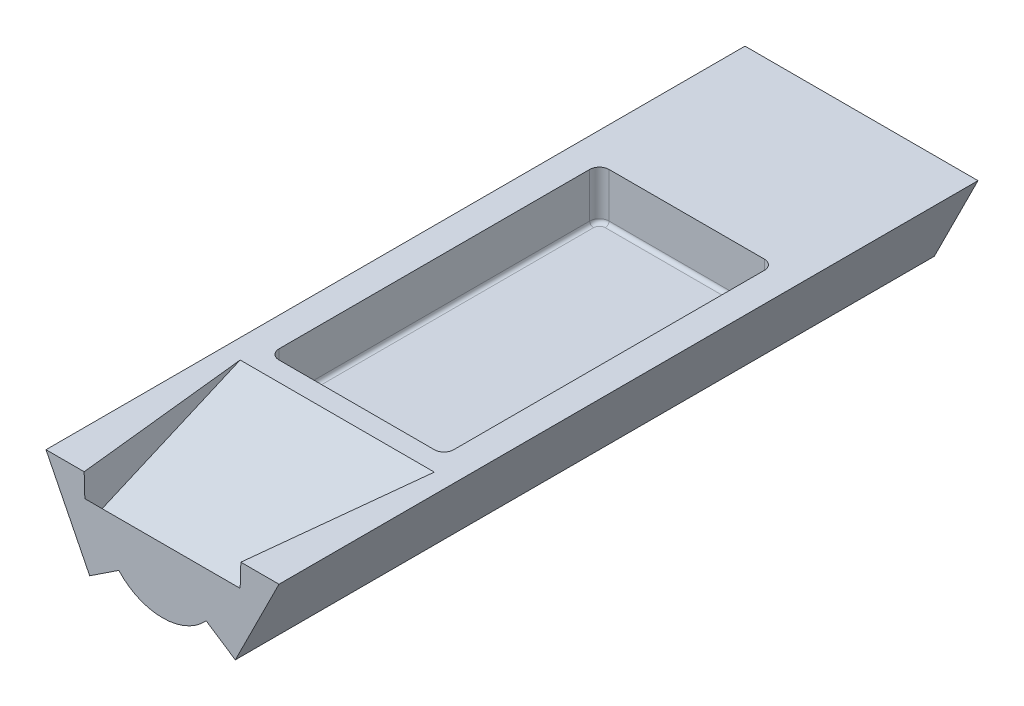
ISO-10303-21;
HEADER;
FILE_DESCRIPTION(('STEP AP214'),'2;1');
FILE_NAME('part.step','',(''),(''),'','','');
FILE_SCHEMA(('AUTOMOTIVE_DESIGN { 1 0 10303 214 1 1 1 1 }'));
ENDSEC;
DATA;
#1=APPLICATION_CONTEXT('core data for automotive mechanical design processes');
#2=APPLICATION_PROTOCOL_DEFINITION('international standard','automotive_design',2000,#1);
#3=PRODUCT_CONTEXT('',#1,'mechanical');
#4=PRODUCT('Part','Part','',(#3));
#5=PRODUCT_RELATED_PRODUCT_CATEGORY('part','',(#4));
#6=PRODUCT_DEFINITION_FORMATION('','',#4);
#7=PRODUCT_DEFINITION_CONTEXT('part definition',#1,'design');
#8=PRODUCT_DEFINITION('design','',#6,#7);
#9=PRODUCT_DEFINITION_SHAPE('','',#8);
#10=(LENGTH_UNIT() NAMED_UNIT(*) SI_UNIT(.MILLI.,.METRE.));
#11=(NAMED_UNIT(*) PLANE_ANGLE_UNIT() SI_UNIT($,.RADIAN.));
#12=(NAMED_UNIT(*) SI_UNIT($,.STERADIAN.) SOLID_ANGLE_UNIT());
#13=UNCERTAINTY_MEASURE_WITH_UNIT(LENGTH_MEASURE(1.E-05),#10,'distance_accuracy_value','');
#14=(GEOMETRIC_REPRESENTATION_CONTEXT(3) GLOBAL_UNCERTAINTY_ASSIGNED_CONTEXT((#13)) GLOBAL_UNIT_ASSIGNED_CONTEXT((#10,
#11,#12)) REPRESENTATION_CONTEXT('',''));
#15=CARTESIAN_POINT('',(0.,0.,0.));
#16=DIRECTION('',(0.,0.,1.));
#17=DIRECTION('',(1.,0.,0.));
#18=AXIS2_PLACEMENT_3D('',#15,#16,#17);
#19=CARTESIAN_POINT('',(0.,101.6,0.));
#20=DIRECTION('',(0.,-1.,0.));
#21=DIRECTION('',(0.,0.,-1.));
#22=AXIS2_PLACEMENT_3D('',#19,#20,#21);
#23=PLANE('',#22);
#24=CARTESIAN_POINT('',(203.2,101.6,-533.4));
#25=DIRECTION('',(0.,-1.,0.));
#26=DIRECTION('',(0.,0.,-1.));
#27=AXIS2_PLACEMENT_3D('',#24,#25,#26);
#28=CIRCLE('',#27,15.4);
#29=CARTESIAN_POINT('',(218.6,101.6,-533.4));
#30=VERTEX_POINT('',#29);
#31=CARTESIAN_POINT('',(203.2,101.6,-518.));
#32=VERTEX_POINT('',#31);
#33=EDGE_CURVE('E364',#30,#32,#28,.T.);
#34=ORIENTED_EDGE('',*,*,#33,.F.);
#35=DIRECTION('',(0.,0.,-1.));
#36=VECTOR('',#35,1.);
#37=CARTESIAN_POINT('',(218.6,101.6,-1371.6));
#38=LINE('',#37,#36);
#39=CARTESIAN_POINT('',(218.6,101.6,-1346.2));
#40=VERTEX_POINT('',#39);
#41=EDGE_CURVE('E323',#30,#40,#38,.T.);
#42=ORIENTED_EDGE('',*,*,#41,.T.);
#43=CARTESIAN_POINT('',(203.2,101.6,-1346.2));
#44=DIRECTION('',(0.,-1.,0.));
#45=DIRECTION('',(0.,0.,-1.));
#46=AXIS2_PLACEMENT_3D('',#43,#44,#45);
#47=CIRCLE('',#46,15.4);
#48=CARTESIAN_POINT('',(203.2,101.6,-1361.6));
#49=VERTEX_POINT('',#48);
#50=EDGE_CURVE('E353',#49,#40,#47,.T.);
#51=ORIENTED_EDGE('',*,*,#50,.F.);
#52=DIRECTION('',(-1.,0.,0.));
#53=VECTOR('',#52,1.);
#54=CARTESIAN_POINT('',(-228.6,101.6,-1361.6));
#55=LINE('',#54,#53);
#56=CARTESIAN_POINT('',(-203.2,101.6,-1361.6));
#57=VERTEX_POINT('',#56);
#58=EDGE_CURVE('E327',#49,#57,#55,.T.);
#59=ORIENTED_EDGE('',*,*,#58,.T.);
#60=CARTESIAN_POINT('',(-203.2,101.6,-1346.2));
#61=DIRECTION('',(0.,-1.,0.));
#62=DIRECTION('',(0.,0.,-1.));
#63=AXIS2_PLACEMENT_3D('',#60,#61,#62);
#64=CIRCLE('',#63,15.4);
#65=CARTESIAN_POINT('',(-218.6,101.6,-1346.2));
#66=VERTEX_POINT('',#65);
#67=EDGE_CURVE('E356',#66,#57,#64,.T.);
#68=ORIENTED_EDGE('',*,*,#67,.F.);
#69=DIRECTION('',(0.,0.,1.));
#70=VECTOR('',#69,1.);
#71=CARTESIAN_POINT('',(-218.6,101.6,-508.));
#72=LINE('',#71,#70);
#73=CARTESIAN_POINT('',(-218.6,101.6,-533.4));
#74=VERTEX_POINT('',#73);
#75=EDGE_CURVE('E315',#66,#74,#72,.T.);
#76=ORIENTED_EDGE('',*,*,#75,.T.);
#77=CARTESIAN_POINT('',(-203.2,101.6,-533.4));
#78=DIRECTION('',(0.,-1.,0.));
#79=DIRECTION('',(0.,0.,-1.));
#80=AXIS2_PLACEMENT_3D('',#77,#78,#79);
#81=CIRCLE('',#80,15.4);
#82=CARTESIAN_POINT('',(-203.2,101.6,-518.));
#83=VERTEX_POINT('',#82);
#84=EDGE_CURVE('E360',#83,#74,#81,.T.);
#85=ORIENTED_EDGE('',*,*,#84,.F.);
#86=DIRECTION('',(1.,0.,0.));
#87=VECTOR('',#86,1.);
#88=CARTESIAN_POINT('',(228.6,101.6,-518.));
#89=LINE('',#88,#87);
#90=EDGE_CURVE('E319',#83,#32,#89,.T.);
#91=ORIENTED_EDGE('',*,*,#90,.T.);
#92=EDGE_LOOP('',(#34,#42,#51,#59,#68,#76,#85,#91));
#93=FACE_BOUND('',#92,.T.);
#94=ADVANCED_FACE('F41',(#93),#23,.F.);
#95=CARTESIAN_POINT('',(-304.8,228.6,-1828.8));
#96=DIRECTION('',(0.,1.,0.));
#97=DIRECTION('',(0.,0.,1.));
#98=AXIS2_PLACEMENT_3D('',#95,#96,#97);
#99=PLANE('',#98);
#100=DIRECTION('',(0.,0.,1.));
#101=VECTOR('',#100,1.);
#102=CARTESIAN_POINT('',(-228.6,228.6,-508.));
#103=LINE('',#102,#101);
#104=CARTESIAN_POINT('',(-228.6,228.6,-1346.2));
#105=VERTEX_POINT('',#104);
#106=CARTESIAN_POINT('',(-228.6,228.6,-533.4));
#107=VERTEX_POINT('',#106);
#108=EDGE_CURVE('E421',#105,#107,#103,.T.);
#109=ORIENTED_EDGE('',*,*,#108,.F.);
#110=CARTESIAN_POINT('',(-203.2,228.6,-1346.2));
#111=DIRECTION('',(0.,1.,0.));
#112=DIRECTION('',(0.,0.,1.));
#113=AXIS2_PLACEMENT_3D('',#110,#111,#112);
#114=CIRCLE('',#113,25.4);
#115=CARTESIAN_POINT('',(-203.2,228.6,-1371.6));
#116=VERTEX_POINT('',#115);
#117=EDGE_CURVE('E412',#105,#116,#114,.F.);
#118=ORIENTED_EDGE('',*,*,#117,.T.);
#119=DIRECTION('',(-1.,0.,0.));
#120=VECTOR('',#119,1.);
#121=CARTESIAN_POINT('',(-228.6,228.6,-1371.6));
#122=LINE('',#121,#120);
#123=CARTESIAN_POINT('',(203.2,228.6,-1371.6));
#124=VERTEX_POINT('',#123);
#125=EDGE_CURVE('E217',#124,#116,#122,.T.);
#126=ORIENTED_EDGE('',*,*,#125,.F.);
#127=CARTESIAN_POINT('',(203.2,228.6,-1346.2));
#128=DIRECTION('',(0.,1.,0.));
#129=DIRECTION('',(0.,0.,1.));
#130=AXIS2_PLACEMENT_3D('',#127,#128,#129);
#131=CIRCLE('',#130,25.4);
#132=CARTESIAN_POINT('',(228.6,228.6,-1346.2));
#133=VERTEX_POINT('',#132);
#134=EDGE_CURVE('E409',#124,#133,#131,.F.);
#135=ORIENTED_EDGE('',*,*,#134,.T.);
#136=DIRECTION('',(0.,0.,-1.));
#137=VECTOR('',#136,1.);
#138=CARTESIAN_POINT('',(228.6,228.6,-508.));
#139=LINE('',#138,#137);
#140=CARTESIAN_POINT('',(228.6,228.6,-533.4));
#141=VERTEX_POINT('',#140);
#142=EDGE_CURVE('E452',#141,#133,#139,.T.);
#143=ORIENTED_EDGE('',*,*,#142,.F.);
#144=CARTESIAN_POINT('',(203.2,228.6,-533.4));
#145=DIRECTION('',(0.,1.,0.));
#146=DIRECTION('',(0.,0.,1.));
#147=AXIS2_PLACEMENT_3D('',#144,#145,#146);
#148=CIRCLE('',#147,25.4);
#149=CARTESIAN_POINT('',(203.2,228.6,-508.));
#150=VERTEX_POINT('',#149);
#151=EDGE_CURVE('E11',#141,#150,#148,.F.);
#152=ORIENTED_EDGE('',*,*,#151,.T.);
#153=DIRECTION('',(1.,0.,0.));
#154=VECTOR('',#153,1.);
#155=CARTESIAN_POINT('',(-228.6,228.6,-508.));
#156=LINE('',#155,#154);
#157=CARTESIAN_POINT('',(-203.2,228.6,-508.));
#158=VERTEX_POINT('',#157);
#159=EDGE_CURVE('E454',#158,#150,#156,.T.);
#160=ORIENTED_EDGE('',*,*,#159,.F.);
#161=CARTESIAN_POINT('',(-203.2,228.6,-533.4));
#162=DIRECTION('',(0.,1.,0.));
#163=DIRECTION('',(0.,0.,1.));
#164=AXIS2_PLACEMENT_3D('',#161,#162,#163);
#165=CIRCLE('',#164,25.4);
#166=EDGE_CURVE('E51',#158,#107,#165,.F.);
#167=ORIENTED_EDGE('',*,*,#166,.T.);
#168=EDGE_LOOP('',(#109,#118,#126,#135,#143,#152,#160,#167));
#169=FACE_BOUND('',#168,.T.);
#170=DIRECTION('',(-1.,0.,0.));
#171=VECTOR('',#170,1.);
#172=CARTESIAN_POINT('',(-254.,228.6,-457.2));
#173=LINE('',#172,#171);
#174=CARTESIAN_POINT('',(254.,228.6,-457.2));
#175=VERTEX_POINT('',#174);
#176=CARTESIAN_POINT('',(-254.,228.6,-457.2));
#177=VERTEX_POINT('',#176);
#178=EDGE_CURVE('E212',#175,#177,#173,.T.);
#179=ORIENTED_EDGE('',*,*,#178,.F.);
#180=DIRECTION('',(-0.106712259574942,0.,0.994289944461076));
#181=VECTOR('',#180,1.);
#182=CARTESIAN_POINT('',(393.167435642972,228.6,-1753.8905808893));
#183=LINE('',#182,#181);
#184=CARTESIAN_POINT('',(204.930968024515,228.6,0.));
#185=VERTEX_POINT('',#184);
#186=EDGE_CURVE('E193',#175,#185,#183,.T.);
#187=ORIENTED_EDGE('',*,*,#186,.T.);
#188=DIRECTION('',(-1.,0.,0.));
#189=VECTOR('',#188,1.);
#190=CARTESIAN_POINT('',(-304.8,228.6,0.));
#191=LINE('',#190,#189);
#192=CARTESIAN_POINT('',(304.8,228.6,0.));
#193=VERTEX_POINT('',#192);
#194=EDGE_CURVE('E269',#193,#185,#191,.T.);
#195=ORIENTED_EDGE('',*,*,#194,.F.);
#196=DIRECTION('',(0.,0.,1.));
#197=VECTOR('',#196,1.);
#198=CARTESIAN_POINT('',(304.8,228.6,-1828.8));
#199=LINE('',#198,#197);
#200=CARTESIAN_POINT('',(304.8,228.6,-1828.8));
#201=VERTEX_POINT('',#200);
#202=EDGE_CURVE('E264',#201,#193,#199,.T.);
#203=ORIENTED_EDGE('',*,*,#202,.F.);
#204=DIRECTION('',(-1.,0.,0.));
#205=VECTOR('',#204,1.);
#206=CARTESIAN_POINT('',(-304.8,228.6,-1828.8));
#207=LINE('',#206,#205);
#208=CARTESIAN_POINT('',(-304.8,228.6,-1828.8));
#209=VERTEX_POINT('',#208);
#210=EDGE_CURVE('E243',#201,#209,#207,.T.);
#211=ORIENTED_EDGE('',*,*,#210,.T.);
#212=DIRECTION('',(0.,0.,1.));
#213=VECTOR('',#212,1.);
#214=CARTESIAN_POINT('',(-304.8,228.6,-1828.8));
#215=LINE('',#214,#213);
#216=CARTESIAN_POINT('',(-304.8,228.6,0.));
#217=VERTEX_POINT('',#216);
#218=EDGE_CURVE('E300',#209,#217,#215,.T.);
#219=ORIENTED_EDGE('',*,*,#218,.T.);
#220=CARTESIAN_POINT('',(-204.930968024515,228.6,0.));
#221=VERTEX_POINT('',#220);
#222=EDGE_CURVE('E268',#221,#217,#191,.T.);
#223=ORIENTED_EDGE('',*,*,#222,.F.);
#224=DIRECTION('',(-0.106712259574942,0.,-0.994289944461076));
#225=VECTOR('',#224,1.);
#226=CARTESIAN_POINT('',(-400.109259510025,228.6,-1818.57092497275));
#227=LINE('',#226,#225);
#228=EDGE_CURVE('E206',#221,#177,#227,.T.);
#229=ORIENTED_EDGE('',*,*,#228,.T.);
#230=EDGE_LOOP('',(#179,#187,#195,#203,#211,#219,#223,#229));
#231=FACE_BOUND('',#230,.T.);
#232=ADVANCED_FACE('F220',(#169,#231),#99,.T.);
#233=CARTESIAN_POINT('',(0.,154.808035714286,0.));
#234=DIRECTION('',(0.,0.,1.));
#235=DIRECTION('',(1.,0.,0.));
#236=AXIS2_PLACEMENT_3D('',#233,#234,#235);
#237=PLANE('',#236);
#238=ORIENTED_EDGE('',*,*,#194,.T.);
#239=DIRECTION('',(-0.0287457876984634,-0.999586754458859,0.));
#240=VECTOR('',#239,1.);
#241=CARTESIAN_POINT('',(202.641297844001,148.980543802472,0.));
#242=LINE('',#241,#240);
#243=CARTESIAN_POINT('',(203.2,168.408478103042,0.));
#244=VERTEX_POINT('',#243);
#245=EDGE_CURVE('E199',#185,#244,#242,.T.);
#246=ORIENTED_EDGE('',*,*,#245,.T.);
#247=DIRECTION('',(-1.,0.,0.));
#248=VECTOR('',#247,1.);
#249=CARTESIAN_POINT('',(0.,168.408478103042,0.));
#250=LINE('',#249,#248);
#251=CARTESIAN_POINT('',(-203.2,168.408478103042,0.));
#252=VERTEX_POINT('',#251);
#253=EDGE_CURVE('E290',#244,#252,#250,.T.);
#254=ORIENTED_EDGE('',*,*,#253,.T.);
#255=DIRECTION('',(-0.0287457876984634,0.999586754458859,0.));
#256=VECTOR('',#255,1.);
#257=CARTESIAN_POINT('',(-202.641297844001,148.980543802472,0.));
#258=LINE('',#257,#256);
#259=EDGE_CURVE('E309',#252,#221,#258,.T.);
#260=ORIENTED_EDGE('',*,*,#259,.T.);
#261=ORIENTED_EDGE('',*,*,#222,.T.);
#262=DIRECTION('',(0.447213595499958,-0.894427190999916,0.));
#263=VECTOR('',#262,1.);
#264=CARTESIAN_POINT('',(-304.8,228.6,0.));
#265=LINE('',#264,#263);
#266=CARTESIAN_POINT('',(-190.5,0.,0.));
#267=VERTEX_POINT('',#266);
#268=EDGE_CURVE('E272',#217,#267,#265,.T.);
#269=ORIENTED_EDGE('',*,*,#268,.T.);
#270=DIRECTION('',(0.834065525508075,0.551665386950223,0.));
#271=VECTOR('',#270,1.);
#272=CARTESIAN_POINT('',(-190.5,0.,0.));
#273=LINE('',#272,#271);
#274=CARTESIAN_POINT('',(-114.3,50.4,0.));
#275=VERTEX_POINT('',#274);
#276=EDGE_CURVE('E276',#267,#275,#273,.T.);
#277=ORIENTED_EDGE('',*,*,#276,.T.);
#278=CARTESIAN_POINT('',(0.,154.808035714286,0.));
#279=DIRECTION('',(0.,0.,1.));
#280=DIRECTION('',(1.,0.,0.));
#281=AXIS2_PLACEMENT_3D('',#278,#279,#280);
#282=CIRCLE('',#281,154.808035714286);
#283=CARTESIAN_POINT('',(114.3,50.3999999999999,0.));
#284=VERTEX_POINT('',#283);
#285=EDGE_CURVE('E280',#275,#284,#282,.T.);
#286=ORIENTED_EDGE('',*,*,#285,.T.);
#287=DIRECTION('',(0.834065525508075,-0.551665386950223,0.));
#288=VECTOR('',#287,1.);
#289=CARTESIAN_POINT('',(190.5,0.,0.));
#290=LINE('',#289,#288);
#291=CARTESIAN_POINT('',(190.5,0.,0.));
#292=VERTEX_POINT('',#291);
#293=EDGE_CURVE('E244',#284,#292,#290,.T.);
#294=ORIENTED_EDGE('',*,*,#293,.T.);
#295=DIRECTION('',(0.447213595499958,0.894427190999916,0.));
#296=VECTOR('',#295,1.);
#297=CARTESIAN_POINT('',(190.5,0.,0.));
#298=LINE('',#297,#296);
#299=EDGE_CURVE('E205',#292,#193,#298,.T.);
#300=ORIENTED_EDGE('',*,*,#299,.T.);
#301=EDGE_LOOP('',(#238,#246,#254,#260,#261,#269,#277,#286,#294,#300));
#302=FACE_BOUND('',#301,.T.);
#303=ADVANCED_FACE('F504',(#302),#237,.T.);
#304=CARTESIAN_POINT('',(190.5,0.,-1828.8));
#305=DIRECTION('',(0.894427190999916,-0.447213595499958,0.));
#306=DIRECTION('',(0.447213595499958,0.894427190999916,0.));
#307=AXIS2_PLACEMENT_3D('',#304,#305,#306);
#308=PLANE('',#307);
#309=ORIENTED_EDGE('',*,*,#299,.F.);
#310=DIRECTION('',(0.,0.,1.));
#311=VECTOR('',#310,1.);
#312=CARTESIAN_POINT('',(190.5,0.,-1828.8));
#313=LINE('',#312,#311);
#314=CARTESIAN_POINT('',(190.5,0.,-1828.8));
#315=VERTEX_POINT('',#314);
#316=EDGE_CURVE('E287',#315,#292,#313,.T.);
#317=ORIENTED_EDGE('',*,*,#316,.F.);
#318=DIRECTION('',(0.447213595499958,0.894427190999916,0.));
#319=VECTOR('',#318,1.);
#320=CARTESIAN_POINT('',(190.5,0.,-1828.8));
#321=LINE('',#320,#319);
#322=EDGE_CURVE('E239',#315,#201,#321,.T.);
#323=ORIENTED_EDGE('',*,*,#322,.T.);
#324=ORIENTED_EDGE('',*,*,#202,.T.);
#325=EDGE_LOOP('',(#309,#317,#323,#324));
#326=FACE_BOUND('',#325,.T.);
#327=ADVANCED_FACE('F538',(#326),#308,.T.);
#328=CARTESIAN_POINT('',(190.5,0.,-1828.8));
#329=DIRECTION('',(-0.551665386950223,-0.834065525508075,0.));
#330=DIRECTION('',(0.834065525508075,-0.551665386950223,0.));
#331=AXIS2_PLACEMENT_3D('',#328,#329,#330);
#332=PLANE('',#331);
#333=ORIENTED_EDGE('',*,*,#293,.F.);
#334=DIRECTION('',(0.,0.,1.));
#335=VECTOR('',#334,1.);
#336=CARTESIAN_POINT('',(114.3,50.3999999999999,-1828.8));
#337=LINE('',#336,#335);
#338=CARTESIAN_POINT('',(114.3,50.3999999999999,-1828.8));
#339=VERTEX_POINT('',#338);
#340=EDGE_CURVE('E291',#339,#284,#337,.T.);
#341=ORIENTED_EDGE('',*,*,#340,.F.);
#342=DIRECTION('',(0.834065525508075,-0.551665386950223,0.));
#343=VECTOR('',#342,1.);
#344=CARTESIAN_POINT('',(190.5,0.,-1828.8));
#345=LINE('',#344,#343);
#346=EDGE_CURVE('E260',#339,#315,#345,.T.);
#347=ORIENTED_EDGE('',*,*,#346,.T.);
#348=ORIENTED_EDGE('',*,*,#316,.T.);
#349=EDGE_LOOP('',(#333,#341,#347,#348));
#350=FACE_BOUND('',#349,.T.);
#351=ADVANCED_FACE('F540',(#350),#332,.T.);
#352=CARTESIAN_POINT('',(0.,154.808035714286,-1828.8));
#353=DIRECTION('',(0.,0.,1.));
#354=DIRECTION('',(1.,0.,0.));
#355=AXIS2_PLACEMENT_3D('',#352,#353,#354);
#356=CYLINDRICAL_SURFACE('',#355,154.808035714286);
#357=ORIENTED_EDGE('',*,*,#285,.F.);
#358=DIRECTION('',(0.,0.,1.));
#359=VECTOR('',#358,1.);
#360=CARTESIAN_POINT('',(-114.3,50.4,-1828.8));
#361=LINE('',#360,#359);
#362=CARTESIAN_POINT('',(-114.3,50.4,-1828.8));
#363=VERTEX_POINT('',#362);
#364=EDGE_CURVE('E294',#363,#275,#361,.T.);
#365=ORIENTED_EDGE('',*,*,#364,.F.);
#366=CARTESIAN_POINT('',(0.,154.808035714286,-1828.8));
#367=DIRECTION('',(0.,0.,1.));
#368=DIRECTION('',(1.,0.,0.));
#369=AXIS2_PLACEMENT_3D('',#366,#367,#368);
#370=CIRCLE('',#369,154.808035714286);
#371=EDGE_CURVE('E256',#363,#339,#370,.T.);
#372=ORIENTED_EDGE('',*,*,#371,.T.);
#373=ORIENTED_EDGE('',*,*,#340,.T.);
#374=EDGE_LOOP('',(#357,#365,#372,#373));
#375=FACE_BOUND('',#374,.T.);
#376=ADVANCED_FACE('F543',(#375),#356,.T.);
#377=CARTESIAN_POINT('',(-190.5,0.,-1828.8));
#378=DIRECTION('',(0.551665386950223,-0.834065525508075,0.));
#379=DIRECTION('',(0.834065525508075,0.551665386950223,0.));
#380=AXIS2_PLACEMENT_3D('',#377,#378,#379);
#381=PLANE('',#380);
#382=ORIENTED_EDGE('',*,*,#276,.F.);
#383=DIRECTION('',(0.,0.,1.));
#384=VECTOR('',#383,1.);
#385=CARTESIAN_POINT('',(-190.5,0.,-1828.8));
#386=LINE('',#385,#384);
#387=CARTESIAN_POINT('',(-190.5,0.,-1828.8));
#388=VERTEX_POINT('',#387);
#389=EDGE_CURVE('E297',#388,#267,#386,.T.);
#390=ORIENTED_EDGE('',*,*,#389,.F.);
#391=DIRECTION('',(0.834065525508075,0.551665386950223,0.));
#392=VECTOR('',#391,1.);
#393=CARTESIAN_POINT('',(-190.5,0.,-1828.8));
#394=LINE('',#393,#392);
#395=EDGE_CURVE('E252',#388,#363,#394,.T.);
#396=ORIENTED_EDGE('',*,*,#395,.T.);
#397=ORIENTED_EDGE('',*,*,#364,.T.);
#398=EDGE_LOOP('',(#382,#390,#396,#397));
#399=FACE_BOUND('',#398,.T.);
#400=ADVANCED_FACE('F547',(#399),#381,.T.);
#401=CARTESIAN_POINT('',(-304.8,228.6,-1828.8));
#402=DIRECTION('',(-0.894427190999916,-0.447213595499958,0.));
#403=DIRECTION('',(0.447213595499958,-0.894427190999916,0.));
#404=AXIS2_PLACEMENT_3D('',#401,#402,#403);
#405=PLANE('',#404);
#406=ORIENTED_EDGE('',*,*,#268,.F.);
#407=ORIENTED_EDGE('',*,*,#218,.F.);
#408=DIRECTION('',(0.447213595499958,-0.894427190999916,0.));
#409=VECTOR('',#408,1.);
#410=CARTESIAN_POINT('',(-304.8,228.6,-1828.8));
#411=LINE('',#410,#409);
#412=EDGE_CURVE('E248',#209,#388,#411,.T.);
#413=ORIENTED_EDGE('',*,*,#412,.T.);
#414=ORIENTED_EDGE('',*,*,#389,.T.);
#415=EDGE_LOOP('',(#406,#407,#413,#414));
#416=FACE_BOUND('',#415,.T.);
#417=ADVANCED_FACE('F534',(#416),#405,.T.);
#418=CARTESIAN_POINT('',(0.,154.808035714286,-1828.8));
#419=DIRECTION('',(0.,0.,1.));
#420=DIRECTION('',(1.,0.,0.));
#421=AXIS2_PLACEMENT_3D('',#418,#419,#420);
#422=PLANE('',#421);
#423=ORIENTED_EDGE('',*,*,#322,.F.);
#424=ORIENTED_EDGE('',*,*,#346,.F.);
#425=ORIENTED_EDGE('',*,*,#371,.F.);
#426=ORIENTED_EDGE('',*,*,#395,.F.);
#427=ORIENTED_EDGE('',*,*,#412,.F.);
#428=ORIENTED_EDGE('',*,*,#210,.F.);
#429=EDGE_LOOP('',(#423,#424,#425,#426,#427,#428));
#430=FACE_BOUND('',#429,.T.);
#431=ADVANCED_FACE('F531',(#430),#422,.F.);
#432=CARTESIAN_POINT('',(254.,342.9,-426.573407305123));
#433=DIRECTION('',(-0.993883734673619,0.028581782127906,-0.106668663072209));
#434=DIRECTION('',(-0.106712259574942,0.,0.994289944461076));
#435=AXIS2_PLACEMENT_3D('',#432,#433,#434);
#436=PLANE('',#435);
#437=DIRECTION('',(0.110431526074847,0.257236039151154,-0.96001796764988));
#438=VECTOR('',#437,1.);
#439=CARTESIAN_POINT('',(254.,228.6,-457.2));
#440=LINE('',#439,#438);
#441=CARTESIAN_POINT('',(203.2,110.267932579127,-15.578712220638));
#442=VERTEX_POINT('',#441);
#443=EDGE_CURVE('E197',#442,#175,#440,.T.);
#444=ORIENTED_EDGE('',*,*,#443,.F.);
#445=DIRECTION('',(0.,-0.965925826289068,-0.258819045102521));
#446=VECTOR('',#445,1.);
#447=CARTESIAN_POINT('',(203.2,224.567932579128,15.0478804742394));
#448=LINE('',#447,#446);
#449=EDGE_CURVE('E231',#244,#442,#448,.T.);
#450=ORIENTED_EDGE('',*,*,#449,.F.);
#451=ORIENTED_EDGE('',*,*,#245,.F.);
#452=ORIENTED_EDGE('',*,*,#186,.F.);
#453=EDGE_LOOP('',(#444,#450,#451,#452));
#454=FACE_BOUND('',#453,.T.);
#455=ADVANCED_FACE('F195',(#454),#436,.T.);
#456=CARTESIAN_POINT('',(-254.,342.9,-426.573407305123));
#457=DIRECTION('',(0.993883734673619,0.028581782127906,-0.106668663072209));
#458=DIRECTION('',(-0.106712259574942,0.,-0.994289944461076));
#459=AXIS2_PLACEMENT_3D('',#456,#457,#458);
#460=PLANE('',#459);
#461=ORIENTED_EDGE('',*,*,#259,.F.);
#462=DIRECTION('',(0.,-0.965925826289068,-0.258819045102521));
#463=VECTOR('',#462,1.);
#464=CARTESIAN_POINT('',(-203.2,224.567932579128,15.0478804742394));
#465=LINE('',#464,#463);
#466=CARTESIAN_POINT('',(-203.2,110.267932579127,-15.578712220638));
#467=VERTEX_POINT('',#466);
#468=EDGE_CURVE('E234',#252,#467,#465,.T.);
#469=ORIENTED_EDGE('',*,*,#468,.T.);
#470=DIRECTION('',(0.110431526074847,-0.257236039151154,0.96001796764988));
#471=VECTOR('',#470,1.);
#472=CARTESIAN_POINT('',(-254.,228.6,-457.2));
#473=LINE('',#472,#471);
#474=EDGE_CURVE('E223',#177,#467,#473,.T.);
#475=ORIENTED_EDGE('',*,*,#474,.F.);
#476=ORIENTED_EDGE('',*,*,#228,.F.);
#477=EDGE_LOOP('',(#461,#469,#475,#476));
#478=FACE_BOUND('',#477,.T.);
#479=ADVANCED_FACE('F524',(#478),#460,.T.);
#480=CARTESIAN_POINT('',(-203.2,224.567932579128,15.0478804742394));
#481=DIRECTION('',(0.,0.258819045102521,-0.965925826289068));
#482=DIRECTION('',(0.,0.965925826289068,0.258819045102521));
#483=AXIS2_PLACEMENT_3D('',#480,#481,#482);
#484=PLANE('',#483);
#485=ORIENTED_EDGE('',*,*,#449,.T.);
#486=DIRECTION('',(1.,0.,0.));
#487=VECTOR('',#486,1.);
#488=CARTESIAN_POINT('',(-203.2,110.267932579127,-15.578712220638));
#489=LINE('',#488,#487);
#490=EDGE_CURVE('E215',#467,#442,#489,.T.);
#491=ORIENTED_EDGE('',*,*,#490,.F.);
#492=ORIENTED_EDGE('',*,*,#468,.F.);
#493=ORIENTED_EDGE('',*,*,#253,.F.);
#494=EDGE_LOOP('',(#485,#491,#492,#493));
#495=FACE_BOUND('',#494,.T.);
#496=ADVANCED_FACE('F521',(#495),#484,.T.);
#497=CARTESIAN_POINT('',(0.,98.9867036525611,26.5234073051227));
#498=DIRECTION('',(0.,0.965925826289068,0.258819045102521));
#499=DIRECTION('',(0.,-0.258819045102521,0.965925826289068));
#500=AXIS2_PLACEMENT_3D('',#497,#498,#499);
#501=PLANE('',#500);
#502=ORIENTED_EDGE('',*,*,#443,.T.);
#503=ORIENTED_EDGE('',*,*,#178,.T.);
#504=ORIENTED_EDGE('',*,*,#474,.T.);
#505=ORIENTED_EDGE('',*,*,#490,.T.);
#506=EDGE_LOOP('',(#502,#503,#504,#505));
#507=FACE_BOUND('',#506,.T.);
#508=ADVANCED_FACE('F210',(#507),#501,.T.);
#509=CARTESIAN_POINT('',(-228.6,101.6,-508.));
#510=DIRECTION('',(-1.,0.,0.));
#511=DIRECTION('',(0.,0.,1.));
#512=AXIS2_PLACEMENT_3D('',#509,#510,#511);
#513=PLANE('',#512);
#514=DIRECTION('',(0.,0.,1.));
#515=VECTOR('',#514,1.);
#516=CARTESIAN_POINT('',(-228.6,111.6,-1371.6));
#517=LINE('',#516,#515);
#518=CARTESIAN_POINT('',(-228.6,111.6,-533.4));
#519=VERTEX_POINT('',#518);
#520=CARTESIAN_POINT('',(-228.6,111.6,-1346.2));
#521=VERTEX_POINT('',#520);
#522=EDGE_CURVE('E342',#519,#521,#517,.F.);
#523=ORIENTED_EDGE('',*,*,#522,.T.);
#524=DIRECTION('',(0.,1.,0.));
#525=VECTOR('',#524,1.);
#526=CARTESIAN_POINT('',(-228.6,228.6,-1346.2));
#527=LINE('',#526,#525);
#528=EDGE_CURVE('E401',#521,#105,#527,.T.);
#529=ORIENTED_EDGE('',*,*,#528,.T.);
#530=ORIENTED_EDGE('',*,*,#108,.T.);
#531=DIRECTION('',(0.,1.,0.));
#532=VECTOR('',#531,1.);
#533=CARTESIAN_POINT('',(-228.6,111.6,-533.4));
#534=LINE('',#533,#532);
#535=EDGE_CURVE('E398',#107,#519,#534,.F.);
#536=ORIENTED_EDGE('',*,*,#535,.T.);
#537=EDGE_LOOP('',(#523,#529,#530,#536));
#538=FACE_BOUND('',#537,.T.);
#539=ADVANCED_FACE('F463',(#538),#513,.F.);
#540=CARTESIAN_POINT('',(-228.6,101.6,-1371.6));
#541=DIRECTION('',(0.,0.,-1.));
#542=DIRECTION('',(-1.,0.,0.));
#543=AXIS2_PLACEMENT_3D('',#540,#541,#542);
#544=PLANE('',#543);
#545=DIRECTION('',(-1.,0.,0.));
#546=VECTOR('',#545,1.);
#547=CARTESIAN_POINT('',(228.6,111.6,-1371.6));
#548=LINE('',#547,#546);
#549=CARTESIAN_POINT('',(-203.2,111.6,-1371.6));
#550=VERTEX_POINT('',#549);
#551=CARTESIAN_POINT('',(203.2,111.6,-1371.6));
#552=VERTEX_POINT('',#551);
#553=EDGE_CURVE('E331',#550,#552,#548,.F.);
#554=ORIENTED_EDGE('',*,*,#553,.T.);
#555=DIRECTION('',(0.,1.,0.));
#556=VECTOR('',#555,1.);
#557=CARTESIAN_POINT('',(203.2,228.6,-1371.6));
#558=LINE('',#557,#556);
#559=EDGE_CURVE('E389',#552,#124,#558,.T.);
#560=ORIENTED_EDGE('',*,*,#559,.T.);
#561=ORIENTED_EDGE('',*,*,#125,.T.);
#562=DIRECTION('',(0.,1.,0.));
#563=VECTOR('',#562,1.);
#564=CARTESIAN_POINT('',(-203.2,111.6,-1371.6));
#565=LINE('',#564,#563);
#566=EDGE_CURVE('E386',#116,#550,#565,.F.);
#567=ORIENTED_EDGE('',*,*,#566,.T.);
#568=EDGE_LOOP('',(#554,#560,#561,#567));
#569=FACE_BOUND('',#568,.T.);
#570=ADVANCED_FACE('F445',(#569),#544,.F.);
#571=CARTESIAN_POINT('',(228.6,101.6,-508.));
#572=DIRECTION('',(1.,0.,0.));
#573=DIRECTION('',(0.,0.,-1.));
#574=AXIS2_PLACEMENT_3D('',#571,#572,#573);
#575=PLANE('',#574);
#576=ORIENTED_EDGE('',*,*,#142,.T.);
#577=DIRECTION('',(0.,1.,0.));
#578=VECTOR('',#577,1.);
#579=CARTESIAN_POINT('',(228.6,111.6,-1346.2));
#580=LINE('',#579,#578);
#581=CARTESIAN_POINT('',(228.6,111.6,-1346.2));
#582=VERTEX_POINT('',#581);
#583=EDGE_CURVE('E395',#133,#582,#580,.F.);
#584=ORIENTED_EDGE('',*,*,#583,.T.);
#585=DIRECTION('',(0.,0.,-1.));
#586=VECTOR('',#585,1.);
#587=CARTESIAN_POINT('',(228.6,111.6,-508.));
#588=LINE('',#587,#586);
#589=CARTESIAN_POINT('',(228.6,111.6,-533.4));
#590=VERTEX_POINT('',#589);
#591=EDGE_CURVE('E335',#582,#590,#588,.F.);
#592=ORIENTED_EDGE('',*,*,#591,.T.);
#593=DIRECTION('',(0.,1.,0.));
#594=VECTOR('',#593,1.);
#595=CARTESIAN_POINT('',(228.6,228.6,-533.4));
#596=LINE('',#595,#594);
#597=EDGE_CURVE('E392',#590,#141,#596,.T.);
#598=ORIENTED_EDGE('',*,*,#597,.T.);
#599=EDGE_LOOP('',(#576,#584,#592,#598));
#600=FACE_BOUND('',#599,.T.);
#601=ADVANCED_FACE('F509',(#600),#575,.F.);
#602=CARTESIAN_POINT('',(-228.6,101.6,-508.));
#603=DIRECTION('',(0.,0.,1.));
#604=DIRECTION('',(1.,0.,0.));
#605=AXIS2_PLACEMENT_3D('',#602,#603,#604);
#606=PLANE('',#605);
#607=DIRECTION('',(1.,0.,0.));
#608=VECTOR('',#607,1.);
#609=CARTESIAN_POINT('',(-228.6,111.6,-508.));
#610=LINE('',#609,#608);
#611=CARTESIAN_POINT('',(203.2,111.6,-508.));
#612=VERTEX_POINT('',#611);
#613=CARTESIAN_POINT('',(-203.2,111.6,-508.));
#614=VERTEX_POINT('',#613);
#615=EDGE_CURVE('E339',#612,#614,#610,.F.);
#616=ORIENTED_EDGE('',*,*,#615,.T.);
#617=DIRECTION('',(0.,1.,0.));
#618=VECTOR('',#617,1.);
#619=CARTESIAN_POINT('',(-203.2,228.6,-508.));
#620=LINE('',#619,#618);
#621=EDGE_CURVE('E64',#614,#158,#620,.T.);
#622=ORIENTED_EDGE('',*,*,#621,.T.);
#623=ORIENTED_EDGE('',*,*,#159,.T.);
#624=DIRECTION('',(0.,1.,0.));
#625=VECTOR('',#624,1.);
#626=CARTESIAN_POINT('',(203.2,111.6,-508.));
#627=LINE('',#626,#625);
#628=EDGE_CURVE('E404',#150,#612,#627,.F.);
#629=ORIENTED_EDGE('',*,*,#628,.T.);
#630=EDGE_LOOP('',(#616,#622,#623,#629));
#631=FACE_BOUND('',#630,.T.);
#632=ADVANCED_FACE('F512',(#631),#606,.F.);
#633=CARTESIAN_POINT('',(0.,111.6,-518.));
#634=DIRECTION('',(-1.,0.,0.));
#635=DIRECTION('',(0.,0.,1.));
#636=AXIS2_PLACEMENT_3D('',#633,#634,#635);
#637=CYLINDRICAL_SURFACE('',#636,10.);
#638=ORIENTED_EDGE('',*,*,#615,.F.);
#639=CARTESIAN_POINT('',(203.2,111.6,-518.));
#640=DIRECTION('',(1.,0.,0.));
#641=DIRECTION('',(0.,0.,-1.));
#642=AXIS2_PLACEMENT_3D('',#639,#640,#641);
#643=CIRCLE('',#642,10.);
#644=EDGE_CURVE('E349',#612,#32,#643,.T.);
#645=ORIENTED_EDGE('',*,*,#644,.T.);
#646=ORIENTED_EDGE('',*,*,#90,.F.);
#647=CARTESIAN_POINT('',(-203.2,111.6,-518.));
#648=DIRECTION('',(-1.,0.,0.));
#649=DIRECTION('',(0.,0.,1.));
#650=AXIS2_PLACEMENT_3D('',#647,#648,#649);
#651=CIRCLE('',#650,10.);
#652=EDGE_CURVE('E346',#83,#614,#651,.T.);
#653=ORIENTED_EDGE('',*,*,#652,.T.);
#654=EDGE_LOOP('',(#638,#645,#646,#653));
#655=FACE_BOUND('',#654,.T.);
#656=ADVANCED_FACE('F516',(#655),#637,.F.);
#657=CARTESIAN_POINT('',(218.6,111.6,0.));
#658=DIRECTION('',(0.,0.,1.));
#659=DIRECTION('',(1.,0.,0.));
#660=AXIS2_PLACEMENT_3D('',#657,#658,#659);
#661=CYLINDRICAL_SURFACE('',#660,10.);
#662=ORIENTED_EDGE('',*,*,#591,.F.);
#663=CARTESIAN_POINT('',(218.6,111.6,-1346.2));
#664=DIRECTION('',(0.,0.,-1.));
#665=DIRECTION('',(-1.,0.,0.));
#666=AXIS2_PLACEMENT_3D('',#663,#664,#665);
#667=CIRCLE('',#666,10.);
#668=EDGE_CURVE('E382',#582,#40,#667,.T.);
#669=ORIENTED_EDGE('',*,*,#668,.T.);
#670=ORIENTED_EDGE('',*,*,#41,.F.);
#671=CARTESIAN_POINT('',(218.6,111.6,-533.4));
#672=DIRECTION('',(0.,0.,1.));
#673=DIRECTION('',(1.,0.,0.));
#674=AXIS2_PLACEMENT_3D('',#671,#672,#673);
#675=CIRCLE('',#674,10.);
#676=EDGE_CURVE('E379',#30,#590,#675,.T.);
#677=ORIENTED_EDGE('',*,*,#676,.T.);
#678=EDGE_LOOP('',(#662,#669,#670,#677));
#679=FACE_BOUND('',#678,.T.);
#680=ADVANCED_FACE('F496',(#679),#661,.F.);
#681=CARTESIAN_POINT('',(-218.6,111.6,0.));
#682=DIRECTION('',(0.,0.,-1.));
#683=DIRECTION('',(-1.,0.,0.));
#684=AXIS2_PLACEMENT_3D('',#681,#682,#683);
#685=CYLINDRICAL_SURFACE('',#684,10.);
#686=ORIENTED_EDGE('',*,*,#522,.F.);
#687=CARTESIAN_POINT('',(-218.6,111.6,-533.4));
#688=DIRECTION('',(0.,0.,1.));
#689=DIRECTION('',(1.,0.,0.));
#690=AXIS2_PLACEMENT_3D('',#687,#688,#689);
#691=CIRCLE('',#690,10.);
#692=EDGE_CURVE('E370',#519,#74,#691,.T.);
#693=ORIENTED_EDGE('',*,*,#692,.T.);
#694=ORIENTED_EDGE('',*,*,#75,.F.);
#695=CARTESIAN_POINT('',(-218.6,111.6,-1346.2));
#696=DIRECTION('',(0.,0.,-1.));
#697=DIRECTION('',(-1.,0.,0.));
#698=AXIS2_PLACEMENT_3D('',#695,#696,#697);
#699=CIRCLE('',#698,10.);
#700=EDGE_CURVE('E367',#66,#521,#699,.T.);
#701=ORIENTED_EDGE('',*,*,#700,.T.);
#702=EDGE_LOOP('',(#686,#693,#694,#701));
#703=FACE_BOUND('',#702,.T.);
#704=ADVANCED_FACE('F476',(#703),#685,.F.);
#705=CARTESIAN_POINT('',(0.,111.6,-1361.6));
#706=DIRECTION('',(1.,0.,0.));
#707=DIRECTION('',(0.,0.,-1.));
#708=AXIS2_PLACEMENT_3D('',#705,#706,#707);
#709=CYLINDRICAL_SURFACE('',#708,10.);
#710=ORIENTED_EDGE('',*,*,#553,.F.);
#711=CARTESIAN_POINT('',(-203.2,111.6,-1361.6));
#712=DIRECTION('',(-1.,0.,0.));
#713=DIRECTION('',(0.,0.,1.));
#714=AXIS2_PLACEMENT_3D('',#711,#712,#713);
#715=CIRCLE('',#714,10.);
#716=EDGE_CURVE('E376',#550,#57,#715,.T.);
#717=ORIENTED_EDGE('',*,*,#716,.T.);
#718=ORIENTED_EDGE('',*,*,#58,.F.);
#719=CARTESIAN_POINT('',(203.2,111.6,-1361.6));
#720=DIRECTION('',(1.,0.,0.));
#721=DIRECTION('',(0.,0.,-1.));
#722=AXIS2_PLACEMENT_3D('',#719,#720,#721);
#723=CIRCLE('',#722,10.);
#724=EDGE_CURVE('E373',#49,#552,#723,.T.);
#725=ORIENTED_EDGE('',*,*,#724,.T.);
#726=EDGE_LOOP('',(#710,#717,#718,#725));
#727=FACE_BOUND('',#726,.T.);
#728=ADVANCED_FACE('F485',(#727),#709,.F.);
#729=CARTESIAN_POINT('',(203.2,101.6,-533.4));
#730=DIRECTION('',(0.,-1.,0.));
#731=DIRECTION('',(0.,0.,-1.));
#732=AXIS2_PLACEMENT_3D('',#729,#730,#731);
#733=CYLINDRICAL_SURFACE('',#732,25.4);
#734=ORIENTED_EDGE('',*,*,#151,.F.);
#735=ORIENTED_EDGE('',*,*,#597,.F.);
#736=CARTESIAN_POINT('',(203.2,111.6,-533.4));
#737=DIRECTION('',(0.,-1.,0.));
#738=DIRECTION('',(0.,0.,-1.));
#739=AXIS2_PLACEMENT_3D('',#736,#737,#738);
#740=CIRCLE('',#739,25.4);
#741=EDGE_CURVE('E417',#612,#590,#740,.F.);
#742=ORIENTED_EDGE('',*,*,#741,.F.);
#743=ORIENTED_EDGE('',*,*,#628,.F.);
#744=EDGE_LOOP('',(#734,#735,#742,#743));
#745=FACE_BOUND('',#744,.T.);
#746=ADVANCED_FACE('F487',(#745),#733,.F.);
#747=CARTESIAN_POINT('',(203.2,111.6,-533.4));
#748=DIRECTION('',(0.,-1.,0.));
#749=DIRECTION('',(0.,0.,-1.));
#750=AXIS2_PLACEMENT_3D('',#747,#748,#749);
#751=TOROIDAL_SURFACE('',#750,15.4,10.);
#752=ORIENTED_EDGE('',*,*,#644,.F.);
#753=ORIENTED_EDGE('',*,*,#741,.T.);
#754=ORIENTED_EDGE('',*,*,#676,.F.);
#755=ORIENTED_EDGE('',*,*,#33,.T.);
#756=EDGE_LOOP('',(#752,#753,#754,#755));
#757=FACE_BOUND('',#756,.T.);
#758=ADVANCED_FACE('F493',(#757),#751,.F.);
#759=CARTESIAN_POINT('',(-203.2,101.6,-533.4));
#760=DIRECTION('',(0.,-1.,0.));
#761=DIRECTION('',(0.,0.,-1.));
#762=AXIS2_PLACEMENT_3D('',#759,#760,#761);
#763=CYLINDRICAL_SURFACE('',#762,25.4);
#764=ORIENTED_EDGE('',*,*,#166,.F.);
#765=ORIENTED_EDGE('',*,*,#621,.F.);
#766=CARTESIAN_POINT('',(-203.2,111.6,-533.4));
#767=DIRECTION('',(0.,-1.,0.));
#768=DIRECTION('',(0.,0.,-1.));
#769=AXIS2_PLACEMENT_3D('',#766,#767,#768);
#770=CIRCLE('',#769,25.4);
#771=EDGE_CURVE('E422',#519,#614,#770,.F.);
#772=ORIENTED_EDGE('',*,*,#771,.F.);
#773=ORIENTED_EDGE('',*,*,#535,.F.);
#774=EDGE_LOOP('',(#764,#765,#772,#773));
#775=FACE_BOUND('',#774,.T.);
#776=ADVANCED_FACE('F469',(#775),#763,.F.);
#777=CARTESIAN_POINT('',(-203.2,111.6,-533.4));
#778=DIRECTION('',(0.,-1.,0.));
#779=DIRECTION('',(0.,0.,-1.));
#780=AXIS2_PLACEMENT_3D('',#777,#778,#779);
#781=TOROIDAL_SURFACE('',#780,15.4,10.);
#782=ORIENTED_EDGE('',*,*,#652,.F.);
#783=ORIENTED_EDGE('',*,*,#84,.T.);
#784=ORIENTED_EDGE('',*,*,#692,.F.);
#785=ORIENTED_EDGE('',*,*,#771,.T.);
#786=EDGE_LOOP('',(#782,#783,#784,#785));
#787=FACE_BOUND('',#786,.T.);
#788=ADVANCED_FACE('F472',(#787),#781,.F.);
#789=CARTESIAN_POINT('',(-203.2,101.6,-1346.2));
#790=DIRECTION('',(0.,-1.,0.));
#791=DIRECTION('',(0.,0.,-1.));
#792=AXIS2_PLACEMENT_3D('',#789,#790,#791);
#793=CYLINDRICAL_SURFACE('',#792,25.4);
#794=ORIENTED_EDGE('',*,*,#117,.F.);
#795=ORIENTED_EDGE('',*,*,#528,.F.);
#796=CARTESIAN_POINT('',(-203.2,111.6,-1346.2));
#797=DIRECTION('',(0.,-1.,0.));
#798=DIRECTION('',(0.,0.,-1.));
#799=AXIS2_PLACEMENT_3D('',#796,#797,#798);
#800=CIRCLE('',#799,25.4);
#801=EDGE_CURVE('E425',#550,#521,#800,.F.);
#802=ORIENTED_EDGE('',*,*,#801,.F.);
#803=ORIENTED_EDGE('',*,*,#566,.F.);
#804=EDGE_LOOP('',(#794,#795,#802,#803));
#805=FACE_BOUND('',#804,.T.);
#806=ADVANCED_FACE('F483',(#805),#793,.F.);
#807=CARTESIAN_POINT('',(-203.2,111.6,-1346.2));
#808=DIRECTION('',(0.,-1.,0.));
#809=DIRECTION('',(0.,0.,-1.));
#810=AXIS2_PLACEMENT_3D('',#807,#808,#809);
#811=TOROIDAL_SURFACE('',#810,15.4,10.);
#812=ORIENTED_EDGE('',*,*,#700,.F.);
#813=ORIENTED_EDGE('',*,*,#67,.T.);
#814=ORIENTED_EDGE('',*,*,#716,.F.);
#815=ORIENTED_EDGE('',*,*,#801,.T.);
#816=EDGE_LOOP('',(#812,#813,#814,#815));
#817=FACE_BOUND('',#816,.T.);
#818=ADVANCED_FACE('F481',(#817),#811,.F.);
#819=CARTESIAN_POINT('',(203.2,101.6,-1346.2));
#820=DIRECTION('',(0.,-1.,0.));
#821=DIRECTION('',(0.,0.,-1.));
#822=AXIS2_PLACEMENT_3D('',#819,#820,#821);
#823=CYLINDRICAL_SURFACE('',#822,25.4);
#824=ORIENTED_EDGE('',*,*,#134,.F.);
#825=ORIENTED_EDGE('',*,*,#559,.F.);
#826=CARTESIAN_POINT('',(203.2,111.6,-1346.2));
#827=DIRECTION('',(0.,-1.,0.));
#828=DIRECTION('',(0.,0.,-1.));
#829=AXIS2_PLACEMENT_3D('',#826,#827,#828);
#830=CIRCLE('',#829,25.4);
#831=EDGE_CURVE('E45',#582,#552,#830,.F.);
#832=ORIENTED_EDGE('',*,*,#831,.F.);
#833=ORIENTED_EDGE('',*,*,#583,.F.);
#834=EDGE_LOOP('',(#824,#825,#832,#833));
#835=FACE_BOUND('',#834,.T.);
#836=ADVANCED_FACE('F43',(#835),#823,.F.);
#837=CARTESIAN_POINT('',(203.2,111.6,-1346.2));
#838=DIRECTION('',(0.,-1.,0.));
#839=DIRECTION('',(0.,0.,-1.));
#840=AXIS2_PLACEMENT_3D('',#837,#838,#839);
#841=TOROIDAL_SURFACE('',#840,15.4,10.);
#842=ORIENTED_EDGE('',*,*,#668,.F.);
#843=ORIENTED_EDGE('',*,*,#831,.T.);
#844=ORIENTED_EDGE('',*,*,#724,.F.);
#845=ORIENTED_EDGE('',*,*,#50,.T.);
#846=EDGE_LOOP('',(#842,#843,#844,#845));
#847=FACE_BOUND('',#846,.T.);
#848=ADVANCED_FACE('F437',(#847),#841,.F.);
#849=CLOSED_SHELL('',(#94,#232,#303,#327,#351,#376,#400,#417,#431,#455,#479,#496,#508,#539,#570,
#601,#632,#656,#680,#704,#728,#746,#758,#776,#788,#806,#818,#836,#848));
#850=MANIFOLD_SOLID_BREP('B2',#849);
#851=ADVANCED_BREP_SHAPE_REPRESENTATION('',(#18,#850),#14);
#852=SHAPE_DEFINITION_REPRESENTATION(#9,#851);
ENDSEC;
END-ISO-10303-21;
